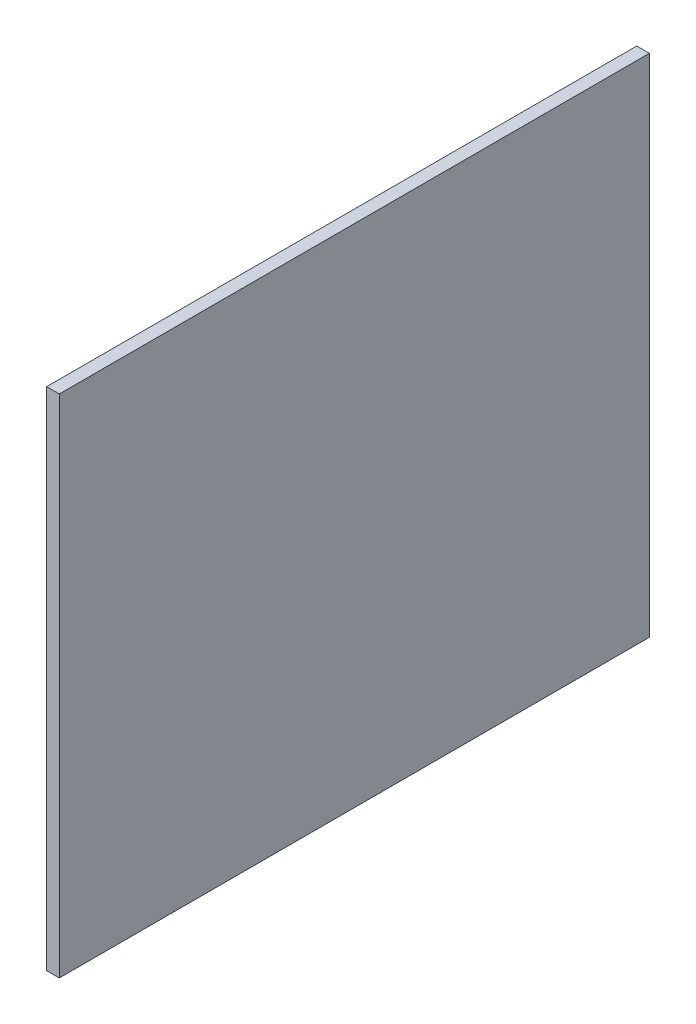
ISO-10303-21;
HEADER;
FILE_DESCRIPTION(('STEP AP214'),'2;1');
FILE_NAME('part.step','',(''),(''),'','','');
FILE_SCHEMA(('AUTOMOTIVE_DESIGN { 1 0 10303 214 1 1 1 1 }'));
ENDSEC;
DATA;
#1=APPLICATION_CONTEXT('core data for automotive mechanical design processes');
#2=APPLICATION_PROTOCOL_DEFINITION('international standard','automotive_design',2000,#1);
#3=PRODUCT_CONTEXT('',#1,'mechanical');
#4=PRODUCT('Part','Part','',(#3));
#5=PRODUCT_RELATED_PRODUCT_CATEGORY('part','',(#4));
#6=PRODUCT_DEFINITION_FORMATION('','',#4);
#7=PRODUCT_DEFINITION_CONTEXT('part definition',#1,'design');
#8=PRODUCT_DEFINITION('design','',#6,#7);
#9=PRODUCT_DEFINITION_SHAPE('','',#8);
#10=(LENGTH_UNIT() NAMED_UNIT(*) SI_UNIT(.MILLI.,.METRE.));
#11=(NAMED_UNIT(*) PLANE_ANGLE_UNIT() SI_UNIT($,.RADIAN.));
#12=(NAMED_UNIT(*) SI_UNIT($,.STERADIAN.) SOLID_ANGLE_UNIT());
#13=UNCERTAINTY_MEASURE_WITH_UNIT(LENGTH_MEASURE(1.E-05),#10,'distance_accuracy_value','');
#14=(GEOMETRIC_REPRESENTATION_CONTEXT(3) GLOBAL_UNCERTAINTY_ASSIGNED_CONTEXT((#13)) GLOBAL_UNIT_ASSIGNED_CONTEXT((#10,
#11,#12)) REPRESENTATION_CONTEXT('',''));
#15=CARTESIAN_POINT('',(0.,0.,0.));
#16=DIRECTION('',(0.,0.,1.));
#17=DIRECTION('',(1.,0.,0.));
#18=AXIS2_PLACEMENT_3D('',#15,#16,#17);
#19=CARTESIAN_POINT('',(3.,0.,0.));
#20=DIRECTION('',(0.,1.,0.));
#21=DIRECTION('',(0.,0.,1.));
#22=AXIS2_PLACEMENT_3D('',#19,#20,#21);
#23=PLANE('',#22);
#24=DIRECTION('',(0.,0.,-1.));
#25=VECTOR('',#24,1.);
#26=CARTESIAN_POINT('',(0.,0.,0.));
#27=LINE('',#26,#25);
#28=CARTESIAN_POINT('',(0.,0.,140.));
#29=VERTEX_POINT('',#28);
#30=CARTESIAN_POINT('',(0.,0.,0.));
#31=VERTEX_POINT('',#30);
#32=EDGE_CURVE('E104',#29,#31,#27,.T.);
#33=ORIENTED_EDGE('',*,*,#32,.T.);
#34=DIRECTION('',(-1.,0.,0.));
#35=VECTOR('',#34,1.);
#36=CARTESIAN_POINT('',(3.,0.,0.));
#37=LINE('',#36,#35);
#38=CARTESIAN_POINT('',(3.,0.,0.));
#39=VERTEX_POINT('',#38);
#40=EDGE_CURVE('E11',#39,#31,#37,.T.);
#41=ORIENTED_EDGE('',*,*,#40,.F.);
#42=DIRECTION('',(0.,0.,-1.));
#43=VECTOR('',#42,1.);
#44=CARTESIAN_POINT('',(3.,0.,0.));
#45=LINE('',#44,#43);
#46=CARTESIAN_POINT('',(3.,0.,140.));
#47=VERTEX_POINT('',#46);
#48=EDGE_CURVE('E92',#47,#39,#45,.T.);
#49=ORIENTED_EDGE('',*,*,#48,.F.);
#50=DIRECTION('',(-1.,0.,0.));
#51=VECTOR('',#50,1.);
#52=CARTESIAN_POINT('',(3.,0.,140.));
#53=LINE('',#52,#51);
#54=EDGE_CURVE('E100',#47,#29,#53,.T.);
#55=ORIENTED_EDGE('',*,*,#54,.T.);
#56=EDGE_LOOP('',(#33,#41,#49,#55));
#57=FACE_BOUND('',#56,.T.);
#58=ADVANCED_FACE('F41',(#57),#23,.F.);
#59=CARTESIAN_POINT('',(3.,0.,0.));
#60=DIRECTION('',(0.,0.,1.));
#61=DIRECTION('',(1.,0.,0.));
#62=AXIS2_PLACEMENT_3D('',#59,#60,#61);
#63=PLANE('',#62);
#64=DIRECTION('',(0.,1.,0.));
#65=VECTOR('',#64,1.);
#66=CARTESIAN_POINT('',(0.,0.,0.));
#67=LINE('',#66,#65);
#68=CARTESIAN_POINT('',(0.,120.,0.));
#69=VERTEX_POINT('',#68);
#70=EDGE_CURVE('E96',#31,#69,#67,.T.);
#71=ORIENTED_EDGE('',*,*,#70,.T.);
#72=DIRECTION('',(-1.,0.,0.));
#73=VECTOR('',#72,1.);
#74=CARTESIAN_POINT('',(3.,120.,0.));
#75=LINE('',#74,#73);
#76=CARTESIAN_POINT('',(3.,120.,0.));
#77=VERTEX_POINT('',#76);
#78=EDGE_CURVE('E49',#77,#69,#75,.T.);
#79=ORIENTED_EDGE('',*,*,#78,.F.);
#80=DIRECTION('',(0.,1.,0.));
#81=VECTOR('',#80,1.);
#82=CARTESIAN_POINT('',(3.,0.,0.));
#83=LINE('',#82,#81);
#84=EDGE_CURVE('E87',#39,#77,#83,.T.);
#85=ORIENTED_EDGE('',*,*,#84,.F.);
#86=ORIENTED_EDGE('',*,*,#40,.T.);
#87=EDGE_LOOP('',(#71,#79,#85,#86));
#88=FACE_BOUND('',#87,.T.);
#89=ADVANCED_FACE('F95',(#88),#63,.F.);
#90=CARTESIAN_POINT('',(3.,120.,0.));
#91=DIRECTION('',(0.,-1.,0.));
#92=DIRECTION('',(0.,0.,-1.));
#93=AXIS2_PLACEMENT_3D('',#90,#91,#92);
#94=PLANE('',#93);
#95=DIRECTION('',(0.,0.,1.));
#96=VECTOR('',#95,1.);
#97=CARTESIAN_POINT('',(0.,120.,0.));
#98=LINE('',#97,#96);
#99=CARTESIAN_POINT('',(0.,120.,140.));
#100=VERTEX_POINT('',#99);
#101=EDGE_CURVE('E74',#69,#100,#98,.T.);
#102=ORIENTED_EDGE('',*,*,#101,.T.);
#103=DIRECTION('',(-1.,0.,0.));
#104=VECTOR('',#103,1.);
#105=CARTESIAN_POINT('',(3.,120.,140.));
#106=LINE('',#105,#104);
#107=CARTESIAN_POINT('',(3.,120.,140.));
#108=VERTEX_POINT('',#107);
#109=EDGE_CURVE('E97',#108,#100,#106,.T.);
#110=ORIENTED_EDGE('',*,*,#109,.F.);
#111=DIRECTION('',(0.,0.,1.));
#112=VECTOR('',#111,1.);
#113=CARTESIAN_POINT('',(3.,120.,0.));
#114=LINE('',#113,#112);
#115=EDGE_CURVE('E90',#77,#108,#114,.T.);
#116=ORIENTED_EDGE('',*,*,#115,.F.);
#117=ORIENTED_EDGE('',*,*,#78,.T.);
#118=EDGE_LOOP('',(#102,#110,#116,#117));
#119=FACE_BOUND('',#118,.T.);
#120=ADVANCED_FACE('F98',(#119),#94,.F.);
#121=CARTESIAN_POINT('',(3.,0.,140.));
#122=DIRECTION('',(0.,0.,-1.));
#123=DIRECTION('',(-1.,0.,0.));
#124=AXIS2_PLACEMENT_3D('',#121,#122,#123);
#125=PLANE('',#124);
#126=DIRECTION('',(0.,-1.,0.));
#127=VECTOR('',#126,1.);
#128=CARTESIAN_POINT('',(0.,0.,140.));
#129=LINE('',#128,#127);
#130=EDGE_CURVE('E80',#100,#29,#129,.T.);
#131=ORIENTED_EDGE('',*,*,#130,.T.);
#132=ORIENTED_EDGE('',*,*,#54,.F.);
#133=DIRECTION('',(0.,-1.,0.));
#134=VECTOR('',#133,1.);
#135=CARTESIAN_POINT('',(3.,0.,140.));
#136=LINE('',#135,#134);
#137=EDGE_CURVE('E57',#108,#47,#136,.T.);
#138=ORIENTED_EDGE('',*,*,#137,.F.);
#139=ORIENTED_EDGE('',*,*,#109,.T.);
#140=EDGE_LOOP('',(#131,#132,#138,#139));
#141=FACE_BOUND('',#140,.T.);
#142=ADVANCED_FACE('F111',(#141),#125,.F.);
#143=CARTESIAN_POINT('',(3.,0.,0.));
#144=DIRECTION('',(-1.,0.,0.));
#145=DIRECTION('',(0.,0.,1.));
#146=AXIS2_PLACEMENT_3D('',#143,#144,#145);
#147=PLANE('',#146);
#148=ORIENTED_EDGE('',*,*,#48,.T.);
#149=ORIENTED_EDGE('',*,*,#84,.T.);
#150=ORIENTED_EDGE('',*,*,#115,.T.);
#151=ORIENTED_EDGE('',*,*,#137,.T.);
#152=EDGE_LOOP('',(#148,#149,#150,#151));
#153=FACE_BOUND('',#152,.T.);
#154=ADVANCED_FACE('F88',(#153),#147,.F.);
#155=CARTESIAN_POINT('',(0.,0.,0.));
#156=DIRECTION('',(-1.,0.,0.));
#157=DIRECTION('',(0.,0.,1.));
#158=AXIS2_PLACEMENT_3D('',#155,#156,#157);
#159=PLANE('',#158);
#160=ORIENTED_EDGE('',*,*,#32,.F.);
#161=ORIENTED_EDGE('',*,*,#130,.F.);
#162=ORIENTED_EDGE('',*,*,#101,.F.);
#163=ORIENTED_EDGE('',*,*,#70,.F.);
#164=EDGE_LOOP('',(#160,#161,#162,#163));
#165=FACE_BOUND('',#164,.T.);
#166=ADVANCED_FACE('F114',(#165),#159,.T.);
#167=CLOSED_SHELL('',(#58,#89,#120,#142,#154,#166));
#168=MANIFOLD_SOLID_BREP('B2',#167);
#169=ADVANCED_BREP_SHAPE_REPRESENTATION('',(#18,#168),#14);
#170=SHAPE_DEFINITION_REPRESENTATION(#9,#169);
ENDSEC;
END-ISO-10303-21;
